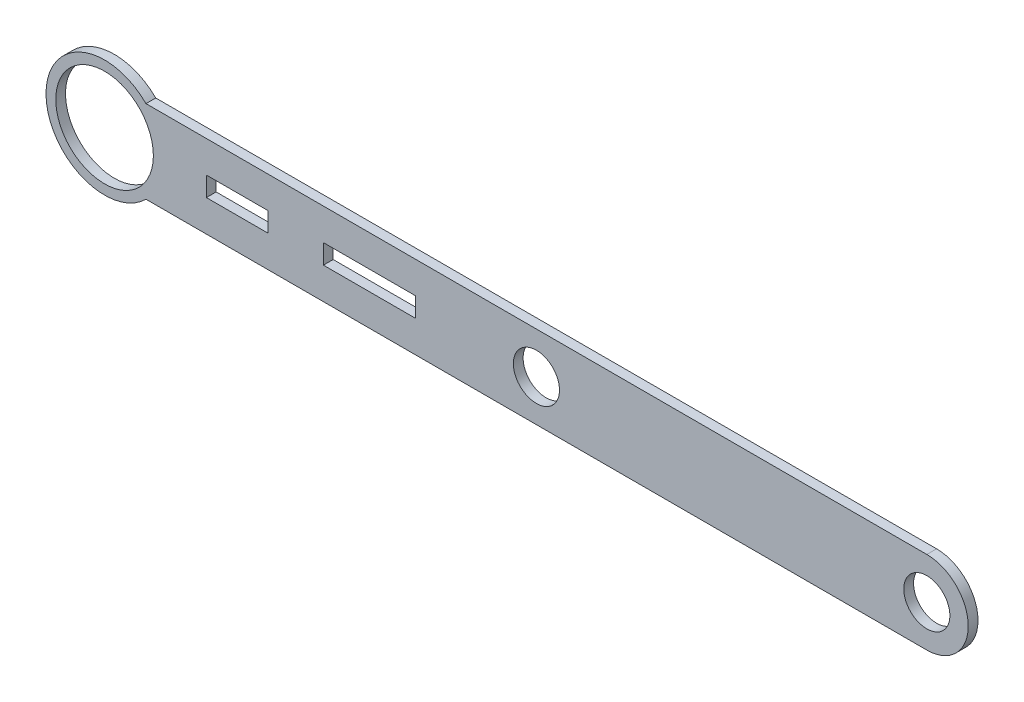
ISO-10303-21;
HEADER;
FILE_DESCRIPTION(('STEP AP214'),'2;1');
FILE_NAME('part.step','',(''),(''),'','','');
FILE_SCHEMA(('AUTOMOTIVE_DESIGN { 1 0 10303 214 1 1 1 1 }'));
ENDSEC;
DATA;
#1=APPLICATION_CONTEXT('core data for automotive mechanical design processes');
#2=APPLICATION_PROTOCOL_DEFINITION('international standard','automotive_design',2000,#1);
#3=PRODUCT_CONTEXT('',#1,'mechanical');
#4=PRODUCT('Part','Part','',(#3));
#5=PRODUCT_RELATED_PRODUCT_CATEGORY('part','',(#4));
#6=PRODUCT_DEFINITION_FORMATION('','',#4);
#7=PRODUCT_DEFINITION_CONTEXT('part definition',#1,'design');
#8=PRODUCT_DEFINITION('design','',#6,#7);
#9=PRODUCT_DEFINITION_SHAPE('','',#8);
#10=(LENGTH_UNIT() NAMED_UNIT(*) SI_UNIT(.MILLI.,.METRE.));
#11=(NAMED_UNIT(*) PLANE_ANGLE_UNIT() SI_UNIT($,.RADIAN.));
#12=(NAMED_UNIT(*) SI_UNIT($,.STERADIAN.) SOLID_ANGLE_UNIT());
#13=UNCERTAINTY_MEASURE_WITH_UNIT(LENGTH_MEASURE(1.E-05),#10,'distance_accuracy_value','');
#14=(GEOMETRIC_REPRESENTATION_CONTEXT(3) GLOBAL_UNCERTAINTY_ASSIGNED_CONTEXT((#13)) GLOBAL_UNIT_ASSIGNED_CONTEXT((#10,
#11,#12)) REPRESENTATION_CONTEXT('',''));
#15=CARTESIAN_POINT('',(0.,0.,0.));
#16=DIRECTION('',(0.,0.,1.));
#17=DIRECTION('',(1.,0.,0.));
#18=AXIS2_PLACEMENT_3D('',#15,#16,#17);
#19=CARTESIAN_POINT('',(267.470384181604,0.,3.175));
#20=DIRECTION('',(0.,0.,1.));
#21=DIRECTION('',(1.,0.,0.));
#22=AXIS2_PLACEMENT_3D('',#19,#20,#21);
#23=PLANE('',#22);
#24=CARTESIAN_POINT('',(0.,0.,3.175));
#25=DIRECTION('',(0.,0.,1.));
#26=DIRECTION('',(1.,0.,0.));
#27=AXIS2_PLACEMENT_3D('',#24,#25,#26);
#28=CIRCLE('',#27,15.875);
#29=CARTESIAN_POINT('',(15.875,0.,3.175));
#30=VERTEX_POINT('',#29);
#31=EDGE_CURVE('E194',#30,#30,#28,.T.);
#32=ORIENTED_EDGE('',*,*,#31,.F.);
#33=EDGE_LOOP('',(#32));
#34=FACE_BOUND('',#33,.T.);
#35=CARTESIAN_POINT('',(267.470384181604,0.,3.175));
#36=DIRECTION('',(0.,0.,1.));
#37=DIRECTION('',(1.,0.,0.));
#38=AXIS2_PLACEMENT_3D('',#35,#36,#37);
#39=CIRCLE('',#38,13.4703841816038);
#40=CARTESIAN_POINT('',(267.470384181603,-13.4703841816038,3.175));
#41=VERTEX_POINT('',#40);
#42=CARTESIAN_POINT('',(267.470384181604,13.4703841816038,3.175));
#43=VERTEX_POINT('',#42);
#44=EDGE_CURVE('E206',#41,#43,#39,.T.);
#45=ORIENTED_EDGE('',*,*,#44,.T.);
#46=DIRECTION('',(-1.,0.,0.));
#47=VECTOR('',#46,1.);
#48=CARTESIAN_POINT('',(13.4703841816037,13.4703841816038,3.175));
#49=LINE('',#48,#47);
#50=CARTESIAN_POINT('',(13.4703841816037,13.4703841816038,3.175));
#51=VERTEX_POINT('',#50);
#52=EDGE_CURVE('E209',#43,#51,#49,.T.);
#53=ORIENTED_EDGE('',*,*,#52,.T.);
#54=CARTESIAN_POINT('',(0.,0.,3.175));
#55=DIRECTION('',(0.,0.,1.));
#56=DIRECTION('',(1.,0.,0.));
#57=AXIS2_PLACEMENT_3D('',#54,#55,#56);
#58=CIRCLE('',#57,19.05);
#59=CARTESIAN_POINT('',(13.4703841816037,-13.4703841816038,3.175));
#60=VERTEX_POINT('',#59);
#61=EDGE_CURVE('E212',#51,#60,#58,.T.);
#62=ORIENTED_EDGE('',*,*,#61,.T.);
#63=DIRECTION('',(1.,0.,0.));
#64=VECTOR('',#63,1.);
#65=CARTESIAN_POINT('',(13.4703841816037,-13.4703841816038,3.175));
#66=LINE('',#65,#64);
#67=EDGE_CURVE('E214',#60,#41,#66,.T.);
#68=ORIENTED_EDGE('',*,*,#67,.T.);
#69=EDGE_LOOP('',(#45,#53,#62,#68));
#70=FACE_BOUND('',#69,.T.);
#71=CARTESIAN_POINT('',(267.470384181604,0.,3.175));
#72=DIRECTION('',(0.,0.,1.));
#73=DIRECTION('',(1.,0.,0.));
#74=AXIS2_PLACEMENT_3D('',#71,#72,#73);
#75=CIRCLE('',#74,7.50000000000001);
#76=CARTESIAN_POINT('',(274.970384181604,0.,3.175));
#77=VERTEX_POINT('',#76);
#78=EDGE_CURVE('E200',#77,#77,#75,.T.);
#79=ORIENTED_EDGE('',*,*,#78,.F.);
#80=EDGE_LOOP('',(#79));
#81=FACE_BOUND('',#80,.T.);
#82=CARTESIAN_POINT('',(140.470384181604,0.,3.175));
#83=DIRECTION('',(0.,0.,1.));
#84=DIRECTION('',(1.,0.,0.));
#85=AXIS2_PLACEMENT_3D('',#82,#83,#84);
#86=CIRCLE('',#85,7.50000000000001);
#87=CARTESIAN_POINT('',(147.970384181604,0.,3.175));
#88=VERTEX_POINT('',#87);
#89=EDGE_CURVE('E188',#88,#88,#86,.T.);
#90=ORIENTED_EDGE('',*,*,#89,.F.);
#91=EDGE_LOOP('',(#90));
#92=FACE_BOUND('',#91,.T.);
#93=DIRECTION('',(-1.,0.,0.));
#94=VECTOR('',#93,1.);
#95=CARTESIAN_POINT('',(33.1171477702266,3.175,3.175));
#96=LINE('',#95,#94);
#97=CARTESIAN_POINT('',(53.1171477702266,3.175,3.175));
#98=VERTEX_POINT('',#97);
#99=CARTESIAN_POINT('',(33.1171477702266,3.175,3.175));
#100=VERTEX_POINT('',#99);
#101=EDGE_CURVE('E159',#98,#100,#96,.T.);
#102=ORIENTED_EDGE('',*,*,#101,.F.);
#103=DIRECTION('',(0.,1.,0.));
#104=VECTOR('',#103,1.);
#105=CARTESIAN_POINT('',(53.1171477702266,-3.175,3.175));
#106=LINE('',#105,#104);
#107=CARTESIAN_POINT('',(53.1171477702266,-3.175,3.175));
#108=VERTEX_POINT('',#107);
#109=EDGE_CURVE('E157',#108,#98,#106,.T.);
#110=ORIENTED_EDGE('',*,*,#109,.F.);
#111=DIRECTION('',(1.,0.,0.));
#112=VECTOR('',#111,1.);
#113=CARTESIAN_POINT('',(33.1171477702266,-3.175,3.175));
#114=LINE('',#113,#112);
#115=CARTESIAN_POINT('',(33.1171477702266,-3.175,3.175));
#116=VERTEX_POINT('',#115);
#117=EDGE_CURVE('E165',#116,#108,#114,.T.);
#118=ORIENTED_EDGE('',*,*,#117,.F.);
#119=DIRECTION('',(0.,-1.,0.));
#120=VECTOR('',#119,1.);
#121=CARTESIAN_POINT('',(33.1171477702266,-3.175,3.175));
#122=LINE('',#121,#120);
#123=EDGE_CURVE('E162',#100,#116,#122,.T.);
#124=ORIENTED_EDGE('',*,*,#123,.F.);
#125=EDGE_LOOP('',(#102,#110,#118,#124));
#126=FACE_BOUND('',#125,.T.);
#127=DIRECTION('',(-1.,0.,0.));
#128=VECTOR('',#127,1.);
#129=CARTESIAN_POINT('',(71.1955948214308,3.175,3.175));
#130=LINE('',#129,#128);
#131=CARTESIAN_POINT('',(101.195594821431,3.175,3.175));
#132=VERTEX_POINT('',#131);
#133=CARTESIAN_POINT('',(71.1955948214308,3.175,3.175));
#134=VERTEX_POINT('',#133);
#135=EDGE_CURVE('E129',#132,#134,#130,.T.);
#136=ORIENTED_EDGE('',*,*,#135,.F.);
#137=DIRECTION('',(0.,1.,0.));
#138=VECTOR('',#137,1.);
#139=CARTESIAN_POINT('',(101.195594821431,3.175,3.175));
#140=LINE('',#139,#138);
#141=CARTESIAN_POINT('',(101.195594821431,-3.175,3.175));
#142=VERTEX_POINT('',#141);
#143=EDGE_CURVE('E121',#142,#132,#140,.T.);
#144=ORIENTED_EDGE('',*,*,#143,.F.);
#145=DIRECTION('',(1.,0.,0.));
#146=VECTOR('',#145,1.);
#147=CARTESIAN_POINT('',(71.1955948214308,-3.175,3.175));
#148=LINE('',#147,#146);
#149=CARTESIAN_POINT('',(71.1955948214308,-3.175,3.175));
#150=VERTEX_POINT('',#149);
#151=EDGE_CURVE('E143',#150,#142,#148,.T.);
#152=ORIENTED_EDGE('',*,*,#151,.F.);
#153=DIRECTION('',(0.,-1.,0.));
#154=VECTOR('',#153,1.);
#155=CARTESIAN_POINT('',(71.1955948214308,3.175,3.175));
#156=LINE('',#155,#154);
#157=EDGE_CURVE('E141',#134,#150,#156,.T.);
#158=ORIENTED_EDGE('',*,*,#157,.F.);
#159=EDGE_LOOP('',(#136,#144,#152,#158));
#160=FACE_BOUND('',#159,.T.);
#161=ADVANCED_FACE('F32',(#34,#70,#81,#92,#126,#160),#23,.T.);
#162=CARTESIAN_POINT('',(267.470384181604,0.,0.));
#163=DIRECTION('',(0.,0.,1.));
#164=DIRECTION('',(1.,0.,0.));
#165=AXIS2_PLACEMENT_3D('',#162,#163,#164);
#166=PLANE('',#165);
#167=DIRECTION('',(0.,1.,0.));
#168=VECTOR('',#167,1.);
#169=CARTESIAN_POINT('',(53.1171477702266,-3.175,0.));
#170=LINE('',#169,#168);
#171=CARTESIAN_POINT('',(53.1171477702266,-3.175,0.));
#172=VERTEX_POINT('',#171);
#173=CARTESIAN_POINT('',(53.1171477702266,3.175,0.));
#174=VERTEX_POINT('',#173);
#175=EDGE_CURVE('E137',#172,#174,#170,.T.);
#176=ORIENTED_EDGE('',*,*,#175,.T.);
#177=DIRECTION('',(-1.,0.,0.));
#178=VECTOR('',#177,1.);
#179=CARTESIAN_POINT('',(33.1171477702266,3.175,0.));
#180=LINE('',#179,#178);
#181=CARTESIAN_POINT('',(33.1171477702266,3.175,0.));
#182=VERTEX_POINT('',#181);
#183=EDGE_CURVE('E170',#174,#182,#180,.T.);
#184=ORIENTED_EDGE('',*,*,#183,.T.);
#185=DIRECTION('',(0.,-1.,0.));
#186=VECTOR('',#185,1.);
#187=CARTESIAN_POINT('',(33.1171477702266,-3.175,0.));
#188=LINE('',#187,#186);
#189=CARTESIAN_POINT('',(33.1171477702266,-3.175,0.));
#190=VERTEX_POINT('',#189);
#191=EDGE_CURVE('E173',#182,#190,#188,.T.);
#192=ORIENTED_EDGE('',*,*,#191,.T.);
#193=DIRECTION('',(1.,0.,0.));
#194=VECTOR('',#193,1.);
#195=CARTESIAN_POINT('',(33.1171477702266,-3.175,0.));
#196=LINE('',#195,#194);
#197=EDGE_CURVE('E160',#190,#172,#196,.T.);
#198=ORIENTED_EDGE('',*,*,#197,.T.);
#199=EDGE_LOOP('',(#176,#184,#192,#198));
#200=FACE_BOUND('',#199,.T.);
#201=CARTESIAN_POINT('',(267.470384181604,0.,0.));
#202=DIRECTION('',(0.,0.,1.));
#203=DIRECTION('',(1.,0.,0.));
#204=AXIS2_PLACEMENT_3D('',#201,#202,#203);
#205=CIRCLE('',#204,13.4703841816038);
#206=CARTESIAN_POINT('',(267.470384181603,-13.4703841816038,0.));
#207=VERTEX_POINT('',#206);
#208=CARTESIAN_POINT('',(267.470384181604,13.4703841816038,0.));
#209=VERTEX_POINT('',#208);
#210=EDGE_CURVE('E203',#207,#209,#205,.T.);
#211=ORIENTED_EDGE('',*,*,#210,.F.);
#212=DIRECTION('',(1.,0.,0.));
#213=VECTOR('',#212,1.);
#214=CARTESIAN_POINT('',(13.4703841816037,-13.4703841816038,0.));
#215=LINE('',#214,#213);
#216=CARTESIAN_POINT('',(13.4703841816037,-13.4703841816038,0.));
#217=VERTEX_POINT('',#216);
#218=EDGE_CURVE('E210',#217,#207,#215,.T.);
#219=ORIENTED_EDGE('',*,*,#218,.F.);
#220=CARTESIAN_POINT('',(0.,0.,0.));
#221=DIRECTION('',(0.,0.,1.));
#222=DIRECTION('',(1.,0.,0.));
#223=AXIS2_PLACEMENT_3D('',#220,#221,#222);
#224=CIRCLE('',#223,19.05);
#225=CARTESIAN_POINT('',(13.4703841816037,13.4703841816038,0.));
#226=VERTEX_POINT('',#225);
#227=EDGE_CURVE('E221',#226,#217,#224,.T.);
#228=ORIENTED_EDGE('',*,*,#227,.F.);
#229=DIRECTION('',(-1.,0.,0.));
#230=VECTOR('',#229,1.);
#231=CARTESIAN_POINT('',(13.4703841816037,13.4703841816038,0.));
#232=LINE('',#231,#230);
#233=EDGE_CURVE('E219',#209,#226,#232,.T.);
#234=ORIENTED_EDGE('',*,*,#233,.F.);
#235=EDGE_LOOP('',(#211,#219,#228,#234));
#236=FACE_BOUND('',#235,.T.);
#237=CARTESIAN_POINT('',(267.470384181604,0.,0.));
#238=DIRECTION('',(0.,0.,1.));
#239=DIRECTION('',(1.,0.,0.));
#240=AXIS2_PLACEMENT_3D('',#237,#238,#239);
#241=CIRCLE('',#240,7.50000000000001);
#242=CARTESIAN_POINT('',(274.970384181604,0.,0.));
#243=VERTEX_POINT('',#242);
#244=EDGE_CURVE('E197',#243,#243,#241,.T.);
#245=ORIENTED_EDGE('',*,*,#244,.T.);
#246=EDGE_LOOP('',(#245));
#247=FACE_BOUND('',#246,.T.);
#248=CARTESIAN_POINT('',(0.,0.,0.));
#249=DIRECTION('',(0.,0.,1.));
#250=DIRECTION('',(1.,0.,0.));
#251=AXIS2_PLACEMENT_3D('',#248,#249,#250);
#252=CIRCLE('',#251,15.875);
#253=CARTESIAN_POINT('',(15.875,0.,0.));
#254=VERTEX_POINT('',#253);
#255=EDGE_CURVE('E191',#254,#254,#252,.T.);
#256=ORIENTED_EDGE('',*,*,#255,.T.);
#257=EDGE_LOOP('',(#256));
#258=FACE_BOUND('',#257,.T.);
#259=CARTESIAN_POINT('',(140.470384181604,0.,0.));
#260=DIRECTION('',(0.,0.,1.));
#261=DIRECTION('',(1.,0.,0.));
#262=AXIS2_PLACEMENT_3D('',#259,#260,#261);
#263=CIRCLE('',#262,7.50000000000001);
#264=CARTESIAN_POINT('',(147.970384181604,0.,0.));
#265=VERTEX_POINT('',#264);
#266=EDGE_CURVE('E187',#265,#265,#263,.T.);
#267=ORIENTED_EDGE('',*,*,#266,.T.);
#268=EDGE_LOOP('',(#267));
#269=FACE_BOUND('',#268,.T.);
#270=DIRECTION('',(0.,1.,0.));
#271=VECTOR('',#270,1.);
#272=CARTESIAN_POINT('',(101.195594821431,3.175,0.));
#273=LINE('',#272,#271);
#274=CARTESIAN_POINT('',(101.195594821431,-3.175,0.));
#275=VERTEX_POINT('',#274);
#276=CARTESIAN_POINT('',(101.195594821431,3.175,0.));
#277=VERTEX_POINT('',#276);
#278=EDGE_CURVE('E55',#275,#277,#273,.T.);
#279=ORIENTED_EDGE('',*,*,#278,.T.);
#280=DIRECTION('',(-1.,0.,0.));
#281=VECTOR('',#280,1.);
#282=CARTESIAN_POINT('',(71.1955948214308,3.175,0.));
#283=LINE('',#282,#281);
#284=CARTESIAN_POINT('',(71.1955948214308,3.175,0.));
#285=VERTEX_POINT('',#284);
#286=EDGE_CURVE('E136',#277,#285,#283,.T.);
#287=ORIENTED_EDGE('',*,*,#286,.T.);
#288=DIRECTION('',(0.,-1.,0.));
#289=VECTOR('',#288,1.);
#290=CARTESIAN_POINT('',(71.1955948214308,3.175,0.));
#291=LINE('',#290,#289);
#292=CARTESIAN_POINT('',(71.1955948214308,-3.175,0.));
#293=VERTEX_POINT('',#292);
#294=EDGE_CURVE('E149',#285,#293,#291,.T.);
#295=ORIENTED_EDGE('',*,*,#294,.T.);
#296=DIRECTION('',(1.,0.,0.));
#297=VECTOR('',#296,1.);
#298=CARTESIAN_POINT('',(71.1955948214308,-3.175,0.));
#299=LINE('',#298,#297);
#300=EDGE_CURVE('E130',#293,#275,#299,.T.);
#301=ORIENTED_EDGE('',*,*,#300,.T.);
#302=EDGE_LOOP('',(#279,#287,#295,#301));
#303=FACE_BOUND('',#302,.T.);
#304=ADVANCED_FACE('F239',(#200,#236,#247,#258,#269,#303),#166,.F.);
#305=CARTESIAN_POINT('',(267.470384181604,0.,3.175));
#306=DIRECTION('',(0.,0.,-1.));
#307=DIRECTION('',(-1.,0.,0.));
#308=AXIS2_PLACEMENT_3D('',#305,#306,#307);
#309=CYLINDRICAL_SURFACE('',#308,13.4703841816038);
#310=ORIENTED_EDGE('',*,*,#210,.T.);
#311=DIRECTION('',(0.,0.,-1.));
#312=VECTOR('',#311,1.);
#313=CARTESIAN_POINT('',(267.470384181604,13.4703841816038,3.175));
#314=LINE('',#313,#312);
#315=EDGE_CURVE('E11',#43,#209,#314,.T.);
#316=ORIENTED_EDGE('',*,*,#315,.F.);
#317=ORIENTED_EDGE('',*,*,#44,.F.);
#318=DIRECTION('',(0.,0.,-1.));
#319=VECTOR('',#318,1.);
#320=CARTESIAN_POINT('',(267.470384181603,-13.4703841816038,3.175));
#321=LINE('',#320,#319);
#322=EDGE_CURVE('E216',#41,#207,#321,.T.);
#323=ORIENTED_EDGE('',*,*,#322,.T.);
#324=EDGE_LOOP('',(#310,#316,#317,#323));
#325=FACE_BOUND('',#324,.T.);
#326=ADVANCED_FACE('F34',(#325),#309,.T.);
#327=CARTESIAN_POINT('',(13.4703841816037,13.4703841816038,3.175));
#328=DIRECTION('',(0.,-1.,0.));
#329=DIRECTION('',(1.,0.,0.));
#330=AXIS2_PLACEMENT_3D('',#327,#328,#329);
#331=PLANE('',#330);
#332=ORIENTED_EDGE('',*,*,#233,.T.);
#333=DIRECTION('',(0.,0.,-1.));
#334=VECTOR('',#333,1.);
#335=CARTESIAN_POINT('',(13.4703841816037,13.4703841816038,3.175));
#336=LINE('',#335,#334);
#337=EDGE_CURVE('E40',#51,#226,#336,.T.);
#338=ORIENTED_EDGE('',*,*,#337,.F.);
#339=ORIENTED_EDGE('',*,*,#52,.F.);
#340=ORIENTED_EDGE('',*,*,#315,.T.);
#341=EDGE_LOOP('',(#332,#338,#339,#340));
#342=FACE_BOUND('',#341,.T.);
#343=ADVANCED_FACE('F250',(#342),#331,.F.);
#344=CARTESIAN_POINT('',(0.,0.,3.175));
#345=DIRECTION('',(0.,0.,-1.));
#346=DIRECTION('',(-1.,0.,0.));
#347=AXIS2_PLACEMENT_3D('',#344,#345,#346);
#348=CYLINDRICAL_SURFACE('',#347,19.05);
#349=ORIENTED_EDGE('',*,*,#227,.T.);
#350=DIRECTION('',(0.,0.,-1.));
#351=VECTOR('',#350,1.);
#352=CARTESIAN_POINT('',(13.4703841816037,-13.4703841816038,3.175));
#353=LINE('',#352,#351);
#354=EDGE_CURVE('E226',#60,#217,#353,.T.);
#355=ORIENTED_EDGE('',*,*,#354,.F.);
#356=ORIENTED_EDGE('',*,*,#61,.F.);
#357=ORIENTED_EDGE('',*,*,#337,.T.);
#358=EDGE_LOOP('',(#349,#355,#356,#357));
#359=FACE_BOUND('',#358,.T.);
#360=ADVANCED_FACE('F233',(#359),#348,.T.);
#361=CARTESIAN_POINT('',(13.4703841816037,-13.4703841816038,3.175));
#362=DIRECTION('',(0.,1.,0.));
#363=DIRECTION('',(0.,0.,1.));
#364=AXIS2_PLACEMENT_3D('',#361,#362,#363);
#365=PLANE('',#364);
#366=ORIENTED_EDGE('',*,*,#218,.T.);
#367=ORIENTED_EDGE('',*,*,#322,.F.);
#368=ORIENTED_EDGE('',*,*,#67,.F.);
#369=ORIENTED_EDGE('',*,*,#354,.T.);
#370=EDGE_LOOP('',(#366,#367,#368,#369));
#371=FACE_BOUND('',#370,.T.);
#372=ADVANCED_FACE('F243',(#371),#365,.F.);
#373=CARTESIAN_POINT('',(267.470384181604,0.,3.175));
#374=DIRECTION('',(0.,0.,-1.));
#375=DIRECTION('',(-1.,0.,0.));
#376=AXIS2_PLACEMENT_3D('',#373,#374,#375);
#377=CYLINDRICAL_SURFACE('',#376,7.50000000000001);
#378=ORIENTED_EDGE('',*,*,#78,.T.);
#379=EDGE_LOOP('',(#378));
#380=FACE_BOUND('',#379,.T.);
#381=ORIENTED_EDGE('',*,*,#244,.F.);
#382=EDGE_LOOP('',(#381));
#383=FACE_BOUND('',#382,.T.);
#384=ADVANCED_FACE('F267',(#380,#383),#377,.F.);
#385=CARTESIAN_POINT('',(0.,0.,3.175));
#386=DIRECTION('',(0.,0.,-1.));
#387=DIRECTION('',(-1.,0.,0.));
#388=AXIS2_PLACEMENT_3D('',#385,#386,#387);
#389=CYLINDRICAL_SURFACE('',#388,15.875);
#390=ORIENTED_EDGE('',*,*,#31,.T.);
#391=EDGE_LOOP('',(#390));
#392=FACE_BOUND('',#391,.T.);
#393=ORIENTED_EDGE('',*,*,#255,.F.);
#394=EDGE_LOOP('',(#393));
#395=FACE_BOUND('',#394,.T.);
#396=ADVANCED_FACE('F274',(#392,#395),#389,.F.);
#397=CARTESIAN_POINT('',(140.470384181604,0.,3.175));
#398=DIRECTION('',(0.,0.,-1.));
#399=DIRECTION('',(-1.,0.,0.));
#400=AXIS2_PLACEMENT_3D('',#397,#398,#399);
#401=CYLINDRICAL_SURFACE('',#400,7.50000000000001);
#402=ORIENTED_EDGE('',*,*,#89,.T.);
#403=EDGE_LOOP('',(#402));
#404=FACE_BOUND('',#403,.T.);
#405=ORIENTED_EDGE('',*,*,#266,.F.);
#406=EDGE_LOOP('',(#405));
#407=FACE_BOUND('',#406,.T.);
#408=ADVANCED_FACE('F279',(#404,#407),#401,.F.);
#409=CARTESIAN_POINT('',(53.1171477702266,-3.175,3.175));
#410=DIRECTION('',(-1.,0.,0.));
#411=DIRECTION('',(0.,0.,1.));
#412=AXIS2_PLACEMENT_3D('',#409,#410,#411);
#413=PLANE('',#412);
#414=ORIENTED_EDGE('',*,*,#175,.F.);
#415=DIRECTION('',(0.,0.,-1.));
#416=VECTOR('',#415,1.);
#417=CARTESIAN_POINT('',(53.1171477702266,-3.175,3.175));
#418=LINE('',#417,#416);
#419=EDGE_CURVE('E167',#108,#172,#418,.T.);
#420=ORIENTED_EDGE('',*,*,#419,.F.);
#421=ORIENTED_EDGE('',*,*,#109,.T.);
#422=DIRECTION('',(0.,0.,-1.));
#423=VECTOR('',#422,1.);
#424=CARTESIAN_POINT('',(53.1171477702266,3.175,3.175));
#425=LINE('',#424,#423);
#426=EDGE_CURVE('E184',#98,#174,#425,.T.);
#427=ORIENTED_EDGE('',*,*,#426,.T.);
#428=EDGE_LOOP('',(#414,#420,#421,#427));
#429=FACE_BOUND('',#428,.T.);
#430=ADVANCED_FACE('F315',(#429),#413,.T.);
#431=CARTESIAN_POINT('',(33.1171477702266,3.175,3.175));
#432=DIRECTION('',(0.,-1.,0.));
#433=DIRECTION('',(0.,0.,-1.));
#434=AXIS2_PLACEMENT_3D('',#431,#432,#433);
#435=PLANE('',#434);
#436=ORIENTED_EDGE('',*,*,#183,.F.);
#437=ORIENTED_EDGE('',*,*,#426,.F.);
#438=ORIENTED_EDGE('',*,*,#101,.T.);
#439=DIRECTION('',(0.,0.,-1.));
#440=VECTOR('',#439,1.);
#441=CARTESIAN_POINT('',(33.1171477702266,3.175,3.175));
#442=LINE('',#441,#440);
#443=EDGE_CURVE('E182',#100,#182,#442,.T.);
#444=ORIENTED_EDGE('',*,*,#443,.T.);
#445=EDGE_LOOP('',(#436,#437,#438,#444));
#446=FACE_BOUND('',#445,.T.);
#447=ADVANCED_FACE('F311',(#446),#435,.T.);
#448=CARTESIAN_POINT('',(33.1171477702266,-3.175,3.175));
#449=DIRECTION('',(1.,0.,0.));
#450=DIRECTION('',(0.,0.,-1.));
#451=AXIS2_PLACEMENT_3D('',#448,#449,#450);
#452=PLANE('',#451);
#453=ORIENTED_EDGE('',*,*,#191,.F.);
#454=ORIENTED_EDGE('',*,*,#443,.F.);
#455=ORIENTED_EDGE('',*,*,#123,.T.);
#456=DIRECTION('',(0.,0.,-1.));
#457=VECTOR('',#456,1.);
#458=CARTESIAN_POINT('',(33.1171477702266,-3.175,3.175));
#459=LINE('',#458,#457);
#460=EDGE_CURVE('E180',#116,#190,#459,.T.);
#461=ORIENTED_EDGE('',*,*,#460,.T.);
#462=EDGE_LOOP('',(#453,#454,#455,#461));
#463=FACE_BOUND('',#462,.T.);
#464=ADVANCED_FACE('F307',(#463),#452,.T.);
#465=CARTESIAN_POINT('',(33.1171477702266,-3.175,3.175));
#466=DIRECTION('',(0.,1.,0.));
#467=DIRECTION('',(0.,0.,1.));
#468=AXIS2_PLACEMENT_3D('',#465,#466,#467);
#469=PLANE('',#468);
#470=ORIENTED_EDGE('',*,*,#197,.F.);
#471=ORIENTED_EDGE('',*,*,#460,.F.);
#472=ORIENTED_EDGE('',*,*,#117,.T.);
#473=ORIENTED_EDGE('',*,*,#419,.T.);
#474=EDGE_LOOP('',(#470,#471,#472,#473));
#475=FACE_BOUND('',#474,.T.);
#476=ADVANCED_FACE('F304',(#475),#469,.T.);
#477=CARTESIAN_POINT('',(101.195594821431,3.175,3.175));
#478=DIRECTION('',(-1.,0.,0.));
#479=DIRECTION('',(0.,0.,1.));
#480=AXIS2_PLACEMENT_3D('',#477,#478,#479);
#481=PLANE('',#480);
#482=ORIENTED_EDGE('',*,*,#278,.F.);
#483=DIRECTION('',(0.,0.,-1.));
#484=VECTOR('',#483,1.);
#485=CARTESIAN_POINT('',(101.195594821431,-3.175,3.175));
#486=LINE('',#485,#484);
#487=EDGE_CURVE('E125',#142,#275,#486,.T.);
#488=ORIENTED_EDGE('',*,*,#487,.F.);
#489=ORIENTED_EDGE('',*,*,#143,.T.);
#490=DIRECTION('',(0.,0.,-1.));
#491=VECTOR('',#490,1.);
#492=CARTESIAN_POINT('',(101.195594821431,3.175,3.175));
#493=LINE('',#492,#491);
#494=EDGE_CURVE('E124',#132,#277,#493,.T.);
#495=ORIENTED_EDGE('',*,*,#494,.T.);
#496=EDGE_LOOP('',(#482,#488,#489,#495));
#497=FACE_BOUND('',#496,.T.);
#498=ADVANCED_FACE('F123',(#497),#481,.T.);
#499=CARTESIAN_POINT('',(71.1955948214308,3.175,3.175));
#500=DIRECTION('',(0.,-1.,0.));
#501=DIRECTION('',(0.,0.,-1.));
#502=AXIS2_PLACEMENT_3D('',#499,#500,#501);
#503=PLANE('',#502);
#504=ORIENTED_EDGE('',*,*,#286,.F.);
#505=ORIENTED_EDGE('',*,*,#494,.F.);
#506=ORIENTED_EDGE('',*,*,#135,.T.);
#507=DIRECTION('',(0.,0.,-1.));
#508=VECTOR('',#507,1.);
#509=CARTESIAN_POINT('',(71.1955948214308,3.175,3.175));
#510=LINE('',#509,#508);
#511=EDGE_CURVE('E138',#134,#285,#510,.T.);
#512=ORIENTED_EDGE('',*,*,#511,.T.);
#513=EDGE_LOOP('',(#504,#505,#506,#512));
#514=FACE_BOUND('',#513,.T.);
#515=ADVANCED_FACE('F133',(#514),#503,.T.);
#516=CARTESIAN_POINT('',(71.1955948214308,3.175,3.175));
#517=DIRECTION('',(1.,0.,0.));
#518=DIRECTION('',(0.,0.,-1.));
#519=AXIS2_PLACEMENT_3D('',#516,#517,#518);
#520=PLANE('',#519);
#521=ORIENTED_EDGE('',*,*,#294,.F.);
#522=ORIENTED_EDGE('',*,*,#511,.F.);
#523=ORIENTED_EDGE('',*,*,#157,.T.);
#524=DIRECTION('',(0.,0.,-1.));
#525=VECTOR('',#524,1.);
#526=CARTESIAN_POINT('',(71.1955948214308,-3.175,3.175));
#527=LINE('',#526,#525);
#528=EDGE_CURVE('E47',#150,#293,#527,.T.);
#529=ORIENTED_EDGE('',*,*,#528,.T.);
#530=EDGE_LOOP('',(#521,#522,#523,#529));
#531=FACE_BOUND('',#530,.T.);
#532=ADVANCED_FACE('F292',(#531),#520,.T.);
#533=CARTESIAN_POINT('',(71.1955948214308,-3.175,3.175));
#534=DIRECTION('',(0.,1.,0.));
#535=DIRECTION('',(0.,0.,1.));
#536=AXIS2_PLACEMENT_3D('',#533,#534,#535);
#537=PLANE('',#536);
#538=ORIENTED_EDGE('',*,*,#300,.F.);
#539=ORIENTED_EDGE('',*,*,#528,.F.);
#540=ORIENTED_EDGE('',*,*,#151,.T.);
#541=ORIENTED_EDGE('',*,*,#487,.T.);
#542=EDGE_LOOP('',(#538,#539,#540,#541));
#543=FACE_BOUND('',#542,.T.);
#544=ADVANCED_FACE('F290',(#543),#537,.T.);
#545=CLOSED_SHELL('',(#161,#304,#326,#343,#360,#372,#384,#396,#408,#430,#447,#464,#476,#498,
#515,#532,#544));
#546=MANIFOLD_SOLID_BREP('B2',#545);
#547=ADVANCED_BREP_SHAPE_REPRESENTATION('',(#18,#546),#14);
#548=SHAPE_DEFINITION_REPRESENTATION(#9,#547);
ENDSEC;
END-ISO-10303-21;
